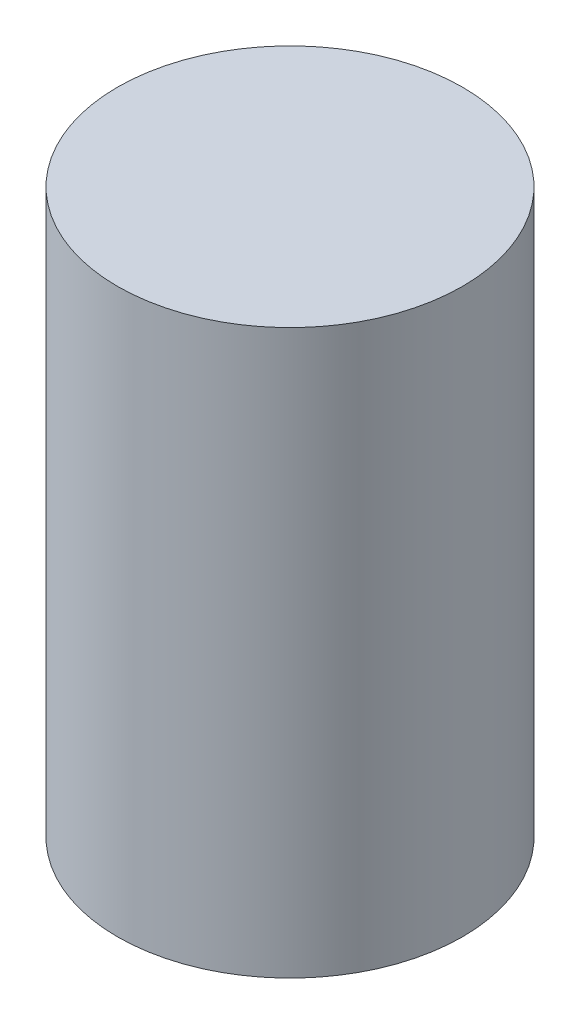
ISO-10303-21;
HEADER;
FILE_DESCRIPTION(('STEP AP214'),'2;1');
FILE_NAME('part.step','',(''),(''),'','','');
FILE_SCHEMA(('AUTOMOTIVE_DESIGN { 1 0 10303 214 1 1 1 1 }'));
ENDSEC;
DATA;
#1=APPLICATION_CONTEXT('core data for automotive mechanical design processes');
#2=APPLICATION_PROTOCOL_DEFINITION('international standard','automotive_design',2000,#1);
#3=PRODUCT_CONTEXT('',#1,'mechanical');
#4=PRODUCT('Part','Part','',(#3));
#5=PRODUCT_RELATED_PRODUCT_CATEGORY('part','',(#4));
#6=PRODUCT_DEFINITION_FORMATION('','',#4);
#7=PRODUCT_DEFINITION_CONTEXT('part definition',#1,'design');
#8=PRODUCT_DEFINITION('design','',#6,#7);
#9=PRODUCT_DEFINITION_SHAPE('','',#8);
#10=(LENGTH_UNIT() NAMED_UNIT(*) SI_UNIT(.MILLI.,.METRE.));
#11=(NAMED_UNIT(*) PLANE_ANGLE_UNIT() SI_UNIT($,.RADIAN.));
#12=(NAMED_UNIT(*) SI_UNIT($,.STERADIAN.) SOLID_ANGLE_UNIT());
#13=UNCERTAINTY_MEASURE_WITH_UNIT(LENGTH_MEASURE(1.E-05),#10,'distance_accuracy_value','');
#14=(GEOMETRIC_REPRESENTATION_CONTEXT(3) GLOBAL_UNCERTAINTY_ASSIGNED_CONTEXT((#13)) GLOBAL_UNIT_ASSIGNED_CONTEXT((#10,
#11,#12)) REPRESENTATION_CONTEXT('',''));
#15=CARTESIAN_POINT('',(0.,0.,0.));
#16=DIRECTION('',(0.,0.,1.));
#17=DIRECTION('',(1.,0.,0.));
#18=AXIS2_PLACEMENT_3D('',#15,#16,#17);
#19=CARTESIAN_POINT('',(0.,8.,0.));
#20=DIRECTION('',(0.,-1.,0.));
#21=DIRECTION('',(0.,0.,-1.));
#22=AXIS2_PLACEMENT_3D('',#19,#20,#21);
#23=CYLINDRICAL_SURFACE('',#22,2.45);
#24=CARTESIAN_POINT('',(0.,8.,0.));
#25=DIRECTION('',(0.,1.,0.));
#26=DIRECTION('',(0.,0.,1.));
#27=AXIS2_PLACEMENT_3D('',#24,#25,#26);
#28=CIRCLE('',#27,2.45);
#29=CARTESIAN_POINT('',(0.,8.,2.45));
#30=VERTEX_POINT('',#29);
#31=EDGE_CURVE('E10',#30,#30,#28,.T.);
#32=ORIENTED_EDGE('',*,*,#31,.F.);
#33=EDGE_LOOP('',(#32));
#34=FACE_BOUND('',#33,.T.);
#35=CARTESIAN_POINT('',(0.,0.,0.));
#36=DIRECTION('',(0.,1.,0.));
#37=DIRECTION('',(0.,0.,1.));
#38=AXIS2_PLACEMENT_3D('',#35,#36,#37);
#39=CIRCLE('',#38,2.45);
#40=CARTESIAN_POINT('',(0.,0.,2.45));
#41=VERTEX_POINT('',#40);
#42=EDGE_CURVE('E40',#41,#41,#39,.T.);
#43=ORIENTED_EDGE('',*,*,#42,.T.);
#44=EDGE_LOOP('',(#43));
#45=FACE_BOUND('',#44,.T.);
#46=ADVANCED_FACE('F37',(#34,#45),#23,.T.);
#47=CARTESIAN_POINT('',(0.,8.,0.));
#48=DIRECTION('',(0.,1.,0.));
#49=DIRECTION('',(0.,0.,1.));
#50=AXIS2_PLACEMENT_3D('',#47,#48,#49);
#51=PLANE('',#50);
#52=ORIENTED_EDGE('',*,*,#31,.T.);
#53=EDGE_LOOP('',(#52));
#54=FACE_BOUND('',#53,.T.);
#55=ADVANCED_FACE('F66',(#54),#51,.T.);
#56=CARTESIAN_POINT('',(0.,0.,0.));
#57=DIRECTION('',(0.,1.,0.));
#58=DIRECTION('',(0.,0.,1.));
#59=AXIS2_PLACEMENT_3D('',#56,#57,#58);
#60=PLANE('',#59);
#61=CARTESIAN_POINT('',(0.,0.,0.));
#62=DIRECTION('',(0.,-1.,0.));
#63=DIRECTION('',(0.,0.,-1.));
#64=AXIS2_PLACEMENT_3D('',#61,#62,#63);
#65=CIRCLE('',#64,1.65);
#66=CARTESIAN_POINT('',(0.,0.,-1.65));
#67=VERTEX_POINT('',#66);
#68=EDGE_CURVE('E49',#67,#67,#65,.T.);
#69=ORIENTED_EDGE('',*,*,#68,.F.);
#70=EDGE_LOOP('',(#69));
#71=FACE_BOUND('',#70,.T.);
#72=ORIENTED_EDGE('',*,*,#42,.F.);
#73=EDGE_LOOP('',(#72));
#74=FACE_BOUND('',#73,.T.);
#75=ADVANCED_FACE('F60',(#71,#74),#60,.F.);
#76=CARTESIAN_POINT('',(0.,7.,0.));
#77=DIRECTION('',(0.,-1.,0.));
#78=DIRECTION('',(0.,0.,-1.));
#79=AXIS2_PLACEMENT_3D('',#76,#77,#78);
#80=CYLINDRICAL_SURFACE('',#79,1.65);
#81=CARTESIAN_POINT('',(0.,7.,0.));
#82=DIRECTION('',(0.,-1.,0.));
#83=DIRECTION('',(0.,0.,-1.));
#84=AXIS2_PLACEMENT_3D('',#81,#82,#83);
#85=CIRCLE('',#84,1.65);
#86=CARTESIAN_POINT('',(0.,7.,-1.65));
#87=VERTEX_POINT('',#86);
#88=EDGE_CURVE('E47',#87,#87,#85,.T.);
#89=ORIENTED_EDGE('',*,*,#88,.F.);
#90=EDGE_LOOP('',(#89));
#91=FACE_BOUND('',#90,.T.);
#92=ORIENTED_EDGE('',*,*,#68,.T.);
#93=EDGE_LOOP('',(#92));
#94=FACE_BOUND('',#93,.T.);
#95=ADVANCED_FACE('F57',(#91,#94),#80,.F.);
#96=CARTESIAN_POINT('',(0.,7.,0.));
#97=DIRECTION('',(0.,-1.,0.));
#98=DIRECTION('',(0.,0.,-1.));
#99=AXIS2_PLACEMENT_3D('',#96,#97,#98);
#100=PLANE('',#99);
#101=ORIENTED_EDGE('',*,*,#88,.T.);
#102=EDGE_LOOP('',(#101));
#103=FACE_BOUND('',#102,.T.);
#104=ADVANCED_FACE('F55',(#103),#100,.T.);
#105=CLOSED_SHELL('',(#46,#55,#75,#95,#104));
#106=MANIFOLD_SOLID_BREP('B2',#105);
#107=ADVANCED_BREP_SHAPE_REPRESENTATION('',(#18,#106),#14);
#108=SHAPE_DEFINITION_REPRESENTATION(#9,#107);
ENDSEC;
END-ISO-10303-21;
